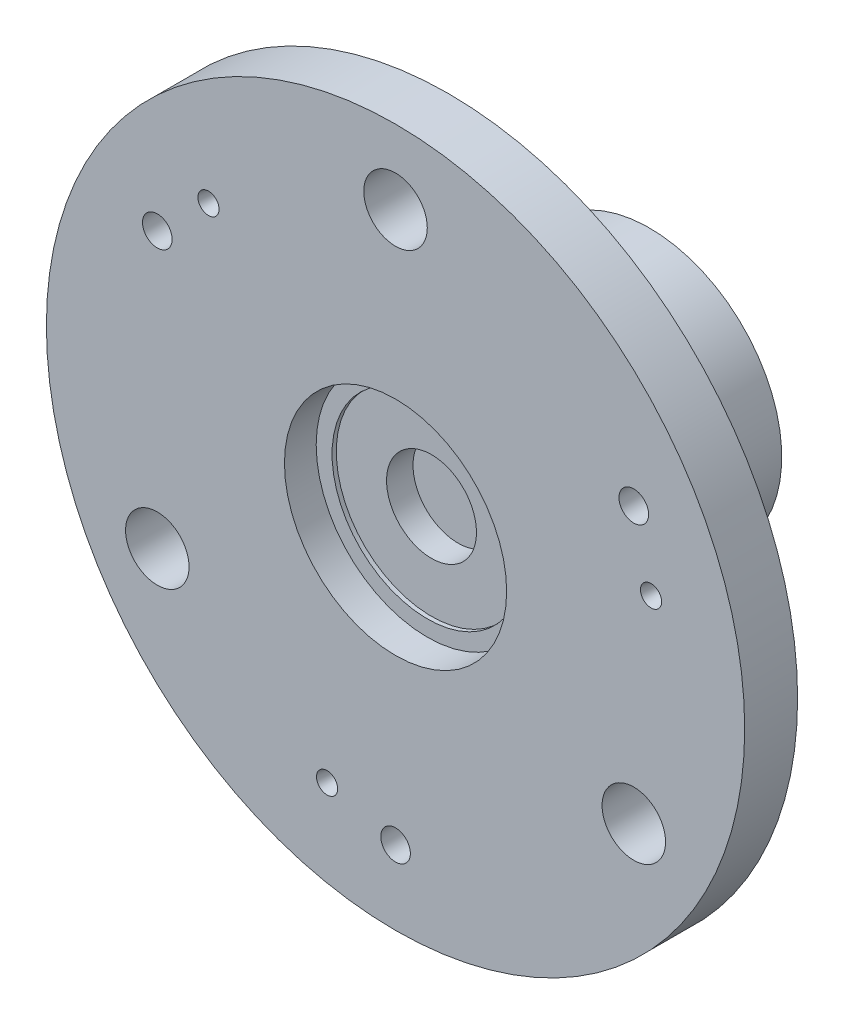
ISO-10303-21;
HEADER;
FILE_DESCRIPTION(('STEP AP214'),'2;1');
FILE_NAME('part.step','',(''),(''),'','','');
FILE_SCHEMA(('AUTOMOTIVE_DESIGN { 1 0 10303 214 1 1 1 1 }'));
ENDSEC;
DATA;
#1=APPLICATION_CONTEXT('core data for automotive mechanical design processes');
#2=APPLICATION_PROTOCOL_DEFINITION('international standard','automotive_design',2000,#1);
#3=PRODUCT_CONTEXT('',#1,'mechanical');
#4=PRODUCT('Part','Part','',(#3));
#5=PRODUCT_RELATED_PRODUCT_CATEGORY('part','',(#4));
#6=PRODUCT_DEFINITION_FORMATION('','',#4);
#7=PRODUCT_DEFINITION_CONTEXT('part definition',#1,'design');
#8=PRODUCT_DEFINITION('design','',#6,#7);
#9=PRODUCT_DEFINITION_SHAPE('','',#8);
#10=(LENGTH_UNIT() NAMED_UNIT(*) SI_UNIT(.MILLI.,.METRE.));
#11=(NAMED_UNIT(*) PLANE_ANGLE_UNIT() SI_UNIT($,.RADIAN.));
#12=(NAMED_UNIT(*) SI_UNIT($,.STERADIAN.) SOLID_ANGLE_UNIT());
#13=UNCERTAINTY_MEASURE_WITH_UNIT(LENGTH_MEASURE(1.E-05),#10,'distance_accuracy_value','');
#14=(GEOMETRIC_REPRESENTATION_CONTEXT(3) GLOBAL_UNCERTAINTY_ASSIGNED_CONTEXT((#13)) GLOBAL_UNIT_ASSIGNED_CONTEXT((#10,
#11,#12)) REPRESENTATION_CONTEXT('',''));
#15=CARTESIAN_POINT('',(0.,0.,0.));
#16=DIRECTION('',(0.,0.,1.));
#17=DIRECTION('',(1.,0.,0.));
#18=AXIS2_PLACEMENT_3D('',#15,#16,#17);
#19=CARTESIAN_POINT('',(0.,0.,-9.));
#20=DIRECTION('',(0.,0.,-1.));
#21=DIRECTION('',(0.,-1.,0.));
#22=AXIS2_PLACEMENT_3D('',#19,#20,#21);
#23=PLANE('',#22);
#24=CARTESIAN_POINT('',(0.,7.,-9.));
#25=DIRECTION('',(0.,0.,-1.));
#26=DIRECTION('',(-1.,0.,0.));
#27=AXIS2_PLACEMENT_3D('',#24,#25,#26);
#28=CIRCLE('',#27,2.1);
#29=CARTESIAN_POINT('',(-2.1,7.,-9.));
#30=VERTEX_POINT('',#29);
#31=EDGE_CURVE('E11',#30,#30,#28,.T.);
#32=ORIENTED_EDGE('',*,*,#31,.T.);
#33=EDGE_LOOP('',(#32));
#34=FACE_BOUND('',#33,.T.);
#35=ADVANCED_FACE('F17',(#34),#23,.T.);
#36=CARTESIAN_POINT('',(0.,7.,-9.));
#37=DIRECTION('',(0.,0.,-1.));
#38=DIRECTION('',(-1.,0.,0.));
#39=AXIS2_PLACEMENT_3D('',#36,#37,#38);
#40=CYLINDRICAL_SURFACE('',#39,2.1);
#41=CARTESIAN_POINT('',(0.,7.,-19.));
#42=DIRECTION('',(0.,0.,-1.));
#43=DIRECTION('',(-1.,0.,0.));
#44=AXIS2_PLACEMENT_3D('',#41,#42,#43);
#45=CIRCLE('',#44,2.1);
#46=CARTESIAN_POINT('',(-2.1,7.,-19.));
#47=VERTEX_POINT('',#46);
#48=EDGE_CURVE('E299',#47,#47,#45,.T.);
#49=ORIENTED_EDGE('',*,*,#48,.T.);
#50=EDGE_LOOP('',(#49));
#51=FACE_BOUND('',#50,.T.);
#52=ORIENTED_EDGE('',*,*,#31,.F.);
#53=EDGE_LOOP('',(#52));
#54=FACE_BOUND('',#53,.T.);
#55=ADVANCED_FACE('F396',(#51,#54),#40,.F.);
#56=CARTESIAN_POINT('',(0.,0.,-9.));
#57=DIRECTION('',(0.,0.,-1.));
#58=DIRECTION('',(0.,-1.,0.));
#59=AXIS2_PLACEMENT_3D('',#56,#57,#58);
#60=PLANE('',#59);
#61=CARTESIAN_POINT('',(7.,0.,-9.));
#62=DIRECTION('',(0.,0.,-1.));
#63=DIRECTION('',(-1.,0.,0.));
#64=AXIS2_PLACEMENT_3D('',#61,#62,#63);
#65=CIRCLE('',#64,2.1);
#66=CARTESIAN_POINT('',(4.9,0.,-9.));
#67=VERTEX_POINT('',#66);
#68=EDGE_CURVE('E28',#67,#67,#65,.T.);
#69=ORIENTED_EDGE('',*,*,#68,.T.);
#70=EDGE_LOOP('',(#69));
#71=FACE_BOUND('',#70,.T.);
#72=ADVANCED_FACE('F401',(#71),#60,.T.);
#73=CARTESIAN_POINT('',(7.,0.,-9.));
#74=DIRECTION('',(0.,0.,-1.));
#75=DIRECTION('',(-1.,0.,0.));
#76=AXIS2_PLACEMENT_3D('',#73,#74,#75);
#77=CYLINDRICAL_SURFACE('',#76,2.1);
#78=CARTESIAN_POINT('',(7.,0.,-19.));
#79=DIRECTION('',(0.,0.,-1.));
#80=DIRECTION('',(-1.,0.,0.));
#81=AXIS2_PLACEMENT_3D('',#78,#79,#80);
#82=CIRCLE('',#81,2.1);
#83=CARTESIAN_POINT('',(4.9,0.,-19.));
#84=VERTEX_POINT('',#83);
#85=EDGE_CURVE('E302',#84,#84,#82,.T.);
#86=ORIENTED_EDGE('',*,*,#85,.T.);
#87=EDGE_LOOP('',(#86));
#88=FACE_BOUND('',#87,.T.);
#89=ORIENTED_EDGE('',*,*,#68,.F.);
#90=EDGE_LOOP('',(#89));
#91=FACE_BOUND('',#90,.T.);
#92=ADVANCED_FACE('F465',(#88,#91),#77,.F.);
#93=CARTESIAN_POINT('',(0.,0.,-9.));
#94=DIRECTION('',(0.,0.,-1.));
#95=DIRECTION('',(0.,-1.,0.));
#96=AXIS2_PLACEMENT_3D('',#93,#94,#95);
#97=PLANE('',#96);
#98=CARTESIAN_POINT('',(0.,-7.,-9.));
#99=DIRECTION('',(0.,0.,-1.));
#100=DIRECTION('',(-1.,0.,0.));
#101=AXIS2_PLACEMENT_3D('',#98,#99,#100);
#102=CIRCLE('',#101,2.1);
#103=CARTESIAN_POINT('',(-2.1,-7.,-9.));
#104=VERTEX_POINT('',#103);
#105=EDGE_CURVE('E222',#104,#104,#102,.T.);
#106=ORIENTED_EDGE('',*,*,#105,.T.);
#107=EDGE_LOOP('',(#106));
#108=FACE_BOUND('',#107,.T.);
#109=ADVANCED_FACE('F408',(#108),#97,.T.);
#110=CARTESIAN_POINT('',(0.,-7.,-9.));
#111=DIRECTION('',(0.,0.,-1.));
#112=DIRECTION('',(-1.,0.,0.));
#113=AXIS2_PLACEMENT_3D('',#110,#111,#112);
#114=CYLINDRICAL_SURFACE('',#113,2.1);
#115=CARTESIAN_POINT('',(0.,-7.,-19.));
#116=DIRECTION('',(0.,0.,-1.));
#117=DIRECTION('',(-1.,0.,0.));
#118=AXIS2_PLACEMENT_3D('',#115,#116,#117);
#119=CIRCLE('',#118,2.1);
#120=CARTESIAN_POINT('',(-2.1,-7.,-19.));
#121=VERTEX_POINT('',#120);
#122=EDGE_CURVE('E307',#121,#121,#119,.T.);
#123=ORIENTED_EDGE('',*,*,#122,.T.);
#124=EDGE_LOOP('',(#123));
#125=FACE_BOUND('',#124,.T.);
#126=ORIENTED_EDGE('',*,*,#105,.F.);
#127=EDGE_LOOP('',(#126));
#128=FACE_BOUND('',#127,.T.);
#129=ADVANCED_FACE('F405',(#125,#128),#114,.F.);
#130=CARTESIAN_POINT('',(0.,0.,-9.));
#131=DIRECTION('',(0.,0.,-1.));
#132=DIRECTION('',(0.,-1.,0.));
#133=AXIS2_PLACEMENT_3D('',#130,#131,#132);
#134=PLANE('',#133);
#135=CARTESIAN_POINT('',(-7.,0.,-9.));
#136=DIRECTION('',(0.,0.,-1.));
#137=DIRECTION('',(-1.,0.,0.));
#138=AXIS2_PLACEMENT_3D('',#135,#136,#137);
#139=CIRCLE('',#138,2.1);
#140=CARTESIAN_POINT('',(-9.1,0.,-9.));
#141=VERTEX_POINT('',#140);
#142=EDGE_CURVE('E220',#141,#141,#139,.T.);
#143=ORIENTED_EDGE('',*,*,#142,.T.);
#144=EDGE_LOOP('',(#143));
#145=FACE_BOUND('',#144,.T.);
#146=ADVANCED_FACE('F407',(#145),#134,.T.);
#147=CARTESIAN_POINT('',(-7.,0.,-9.));
#148=DIRECTION('',(0.,0.,-1.));
#149=DIRECTION('',(-1.,0.,0.));
#150=AXIS2_PLACEMENT_3D('',#147,#148,#149);
#151=CYLINDRICAL_SURFACE('',#150,2.1);
#152=CARTESIAN_POINT('',(-7.,0.,-19.));
#153=DIRECTION('',(0.,0.,-1.));
#154=DIRECTION('',(-1.,0.,0.));
#155=AXIS2_PLACEMENT_3D('',#152,#153,#154);
#156=CIRCLE('',#155,2.1);
#157=CARTESIAN_POINT('',(-9.1,0.,-19.));
#158=VERTEX_POINT('',#157);
#159=EDGE_CURVE('E304',#158,#158,#156,.T.);
#160=ORIENTED_EDGE('',*,*,#159,.T.);
#161=EDGE_LOOP('',(#160));
#162=FACE_BOUND('',#161,.T.);
#163=ORIENTED_EDGE('',*,*,#142,.F.);
#164=EDGE_LOOP('',(#163));
#165=FACE_BOUND('',#164,.T.);
#166=ADVANCED_FACE('F422',(#162,#165),#151,.F.);
#167=CARTESIAN_POINT('',(0.,0.,-0.9));
#168=DIRECTION('',(0.,0.,1.));
#169=DIRECTION('',(1.,0.,0.));
#170=AXIS2_PLACEMENT_3D('',#167,#168,#169);
#171=PLANE('',#170);
#172=CARTESIAN_POINT('',(0.,0.,-0.9));
#173=DIRECTION('',(0.,0.,1.));
#174=DIRECTION('',(1.,0.,0.));
#175=AXIS2_PLACEMENT_3D('',#172,#173,#174);
#176=CIRCLE('',#175,4.25);
#177=CARTESIAN_POINT('',(4.25,0.,-0.9));
#178=VERTEX_POINT('',#177);
#179=EDGE_CURVE('E223',#178,#178,#176,.T.);
#180=ORIENTED_EDGE('',*,*,#179,.T.);
#181=EDGE_LOOP('',(#180));
#182=FACE_BOUND('',#181,.T.);
#183=ADVANCED_FACE('F447',(#182),#171,.T.);
#184=CARTESIAN_POINT('',(0.,0.,-0.9));
#185=DIRECTION('',(0.,0.,1.));
#186=DIRECTION('',(1.,0.,0.));
#187=AXIS2_PLACEMENT_3D('',#184,#185,#186);
#188=CYLINDRICAL_SURFACE('',#187,4.25);
#189=CARTESIAN_POINT('',(0.,0.,1.6));
#190=DIRECTION('',(0.,0.,1.));
#191=DIRECTION('',(1.,0.,0.));
#192=AXIS2_PLACEMENT_3D('',#189,#190,#191);
#193=CIRCLE('',#192,4.25);
#194=CARTESIAN_POINT('',(4.25,0.,1.6));
#195=VERTEX_POINT('',#194);
#196=EDGE_CURVE('E308',#195,#195,#193,.T.);
#197=ORIENTED_EDGE('',*,*,#196,.T.);
#198=EDGE_LOOP('',(#197));
#199=FACE_BOUND('',#198,.T.);
#200=ORIENTED_EDGE('',*,*,#179,.F.);
#201=EDGE_LOOP('',(#200));
#202=FACE_BOUND('',#201,.T.);
#203=ADVANCED_FACE('F437',(#199,#202),#188,.F.);
#204=CARTESIAN_POINT('',(0.,0.,1.6));
#205=DIRECTION('',(0.,0.,1.));
#206=DIRECTION('',(1.,0.,0.));
#207=AXIS2_PLACEMENT_3D('',#204,#205,#206);
#208=PLANE('',#207);
#209=CARTESIAN_POINT('',(0.,0.,1.6));
#210=DIRECTION('',(0.,0.,1.));
#211=DIRECTION('',(1.,0.,0.));
#212=AXIS2_PLACEMENT_3D('',#209,#210,#211);
#213=CIRCLE('',#212,9.);
#214=CARTESIAN_POINT('',(9.,0.,1.6));
#215=VERTEX_POINT('',#214);
#216=EDGE_CURVE('E253',#215,#215,#213,.T.);
#217=ORIENTED_EDGE('',*,*,#216,.T.);
#218=EDGE_LOOP('',(#217));
#219=FACE_BOUND('',#218,.T.);
#220=ORIENTED_EDGE('',*,*,#196,.F.);
#221=EDGE_LOOP('',(#220));
#222=FACE_BOUND('',#221,.T.);
#223=ADVANCED_FACE('F434',(#219,#222),#208,.T.);
#224=CARTESIAN_POINT('',(0.,0.,2.));
#225=DIRECTION('',(0.,0.,1.));
#226=DIRECTION('',(1.,0.,0.));
#227=AXIS2_PLACEMENT_3D('',#224,#225,#226);
#228=PLANE('',#227);
#229=CARTESIAN_POINT('',(0.,0.,2.));
#230=DIRECTION('',(0.,0.,1.));
#231=DIRECTION('',(1.,0.,0.));
#232=AXIS2_PLACEMENT_3D('',#229,#230,#231);
#233=CIRCLE('',#232,10.5);
#234=CARTESIAN_POINT('',(10.5,0.,2.));
#235=VERTEX_POINT('',#234);
#236=EDGE_CURVE('E267',#235,#235,#233,.T.);
#237=ORIENTED_EDGE('',*,*,#236,.T.);
#238=EDGE_LOOP('',(#237));
#239=FACE_BOUND('',#238,.T.);
#240=CARTESIAN_POINT('',(0.,0.,2.));
#241=DIRECTION('',(0.,0.,1.));
#242=DIRECTION('',(1.,0.,0.));
#243=AXIS2_PLACEMENT_3D('',#240,#241,#242);
#244=CIRCLE('',#243,9.);
#245=CARTESIAN_POINT('',(9.,0.,2.));
#246=VERTEX_POINT('',#245);
#247=EDGE_CURVE('E311',#246,#246,#244,.T.);
#248=ORIENTED_EDGE('',*,*,#247,.F.);
#249=EDGE_LOOP('',(#248));
#250=FACE_BOUND('',#249,.T.);
#251=ADVANCED_FACE('F436',(#239,#250),#228,.T.);
#252=CARTESIAN_POINT('',(0.,0.,2.));
#253=DIRECTION('',(0.,0.,-1.));
#254=DIRECTION('',(-1.,0.,0.));
#255=AXIS2_PLACEMENT_3D('',#252,#253,#254);
#256=CYLINDRICAL_SURFACE('',#255,9.);
#257=ORIENTED_EDGE('',*,*,#247,.T.);
#258=EDGE_LOOP('',(#257));
#259=FACE_BOUND('',#258,.T.);
#260=ORIENTED_EDGE('',*,*,#216,.F.);
#261=EDGE_LOOP('',(#260));
#262=FACE_BOUND('',#261,.T.);
#263=ADVANCED_FACE('F440',(#259,#262),#256,.F.);
#264=CARTESIAN_POINT('',(0.,0.,-19.));
#265=DIRECTION('',(0.,0.,-1.));
#266=DIRECTION('',(0.,-1.,0.));
#267=AXIS2_PLACEMENT_3D('',#264,#265,#266);
#268=PLANE('',#267);
#269=CARTESIAN_POINT('',(0.,0.,-19.));
#270=DIRECTION('',(0.,0.,-1.));
#271=DIRECTION('',(-1.,0.,0.));
#272=AXIS2_PLACEMENT_3D('',#269,#270,#271);
#273=CIRCLE('',#272,12.5);
#274=CARTESIAN_POINT('',(-12.5,0.,-19.));
#275=VERTEX_POINT('',#274);
#276=EDGE_CURVE('E303',#275,#275,#273,.T.);
#277=ORIENTED_EDGE('',*,*,#276,.T.);
#278=EDGE_LOOP('',(#277));
#279=FACE_BOUND('',#278,.T.);
#280=ORIENTED_EDGE('',*,*,#159,.F.);
#281=EDGE_LOOP('',(#280));
#282=FACE_BOUND('',#281,.T.);
#283=ORIENTED_EDGE('',*,*,#122,.F.);
#284=EDGE_LOOP('',(#283));
#285=FACE_BOUND('',#284,.T.);
#286=ORIENTED_EDGE('',*,*,#85,.F.);
#287=EDGE_LOOP('',(#286));
#288=FACE_BOUND('',#287,.T.);
#289=ORIENTED_EDGE('',*,*,#48,.F.);
#290=EDGE_LOOP('',(#289));
#291=FACE_BOUND('',#290,.T.);
#292=ADVANCED_FACE('F443',(#279,#282,#285,#288,#291),#268,.T.);
#293=CARTESIAN_POINT('',(0.,0.,-19.));
#294=DIRECTION('',(0.,0.,1.));
#295=DIRECTION('',(1.,0.,0.));
#296=AXIS2_PLACEMENT_3D('',#293,#294,#295);
#297=CYLINDRICAL_SURFACE('',#296,12.5);
#298=CARTESIAN_POINT('',(0.,0.,-4.));
#299=DIRECTION('',(0.,0.,-1.));
#300=DIRECTION('',(-1.,0.,0.));
#301=AXIS2_PLACEMENT_3D('',#298,#299,#300);
#302=CIRCLE('',#301,12.5);
#303=CARTESIAN_POINT('',(-12.5,0.,-4.));
#304=VERTEX_POINT('',#303);
#305=EDGE_CURVE('E265',#304,#304,#302,.T.);
#306=ORIENTED_EDGE('',*,*,#305,.T.);
#307=EDGE_LOOP('',(#306));
#308=FACE_BOUND('',#307,.T.);
#309=ORIENTED_EDGE('',*,*,#276,.F.);
#310=EDGE_LOOP('',(#309));
#311=FACE_BOUND('',#310,.T.);
#312=ADVANCED_FACE('F472',(#308,#311),#297,.T.);
#313=CARTESIAN_POINT('',(0.,0.,-2.));
#314=DIRECTION('',(0.,0.,1.));
#315=DIRECTION('',(1.,0.,0.));
#316=AXIS2_PLACEMENT_3D('',#313,#314,#315);
#317=CONICAL_SURFACE('',#316,14.5,0.785398163397448);
#318=CARTESIAN_POINT('',(0.,0.,-2.));
#319=DIRECTION('',(0.,0.,-1.));
#320=DIRECTION('',(1.,0.,0.));
#321=AXIS2_PLACEMENT_3D('',#318,#319,#320);
#322=CIRCLE('',#321,14.5);
#323=CARTESIAN_POINT('',(14.5,0.,-2.));
#324=VERTEX_POINT('',#323);
#325=EDGE_CURVE('E226',#324,#324,#322,.T.);
#326=ORIENTED_EDGE('',*,*,#325,.F.);
#327=EDGE_LOOP('',(#326));
#328=FACE_BOUND('',#327,.T.);
#329=CARTESIAN_POINT('',(0.,0.,0.));
#330=DIRECTION('',(0.,0.,1.));
#331=DIRECTION('',(1.,0.,0.));
#332=AXIS2_PLACEMENT_3D('',#329,#330,#331);
#333=CIRCLE('',#332,16.5);
#334=CARTESIAN_POINT('',(16.5,0.,0.));
#335=VERTEX_POINT('',#334);
#336=EDGE_CURVE('E218',#335,#335,#333,.T.);
#337=ORIENTED_EDGE('',*,*,#336,.F.);
#338=EDGE_LOOP('',(#337));
#339=FACE_BOUND('',#338,.T.);
#340=ADVANCED_FACE('F475',(#328,#339),#317,.T.);
#341=CARTESIAN_POINT('',(0.,0.,-0.4));
#342=DIRECTION('',(0.,0.,1.));
#343=DIRECTION('',(1.,0.,0.));
#344=AXIS2_PLACEMENT_3D('',#341,#342,#343);
#345=CYLINDRICAL_SURFACE('',#344,10.5);
#346=CARTESIAN_POINT('',(0.,0.,5.));
#347=DIRECTION('',(0.,0.,1.));
#348=DIRECTION('',(1.,0.,0.));
#349=AXIS2_PLACEMENT_3D('',#346,#347,#348);
#350=CIRCLE('',#349,10.5);
#351=CARTESIAN_POINT('',(10.5,0.,5.));
#352=VERTEX_POINT('',#351);
#353=EDGE_CURVE('E209',#352,#352,#350,.T.);
#354=ORIENTED_EDGE('',*,*,#353,.T.);
#355=EDGE_LOOP('',(#354));
#356=FACE_BOUND('',#355,.T.);
#357=ORIENTED_EDGE('',*,*,#236,.F.);
#358=EDGE_LOOP('',(#357));
#359=FACE_BOUND('',#358,.T.);
#360=ADVANCED_FACE('F486',(#356,#359),#345,.F.);
#361=CARTESIAN_POINT('',(0.,0.,-4.));
#362=DIRECTION('',(0.,0.,-1.));
#363=DIRECTION('',(0.,-1.,0.));
#364=AXIS2_PLACEMENT_3D('',#361,#362,#363);
#365=PLANE('',#364);
#366=CARTESIAN_POINT('',(0.,0.,-4.));
#367=DIRECTION('',(0.,0.,-1.));
#368=DIRECTION('',(-1.,0.,0.));
#369=AXIS2_PLACEMENT_3D('',#366,#367,#368);
#370=CIRCLE('',#369,14.5);
#371=CARTESIAN_POINT('',(-14.5,0.,-4.));
#372=VERTEX_POINT('',#371);
#373=EDGE_CURVE('E233',#372,#372,#370,.T.);
#374=ORIENTED_EDGE('',*,*,#373,.T.);
#375=EDGE_LOOP('',(#374));
#376=FACE_BOUND('',#375,.T.);
#377=ORIENTED_EDGE('',*,*,#305,.F.);
#378=EDGE_LOOP('',(#377));
#379=FACE_BOUND('',#378,.T.);
#380=ADVANCED_FACE('F461',(#376,#379),#365,.T.);
#381=CARTESIAN_POINT('',(0.,0.,-4.));
#382=DIRECTION('',(0.,0.,1.));
#383=DIRECTION('',(1.,0.,0.));
#384=AXIS2_PLACEMENT_3D('',#381,#382,#383);
#385=CYLINDRICAL_SURFACE('',#384,14.5);
#386=ORIENTED_EDGE('',*,*,#373,.F.);
#387=EDGE_LOOP('',(#386));
#388=FACE_BOUND('',#387,.T.);
#389=ORIENTED_EDGE('',*,*,#325,.T.);
#390=EDGE_LOOP('',(#389));
#391=FACE_BOUND('',#390,.T.);
#392=ADVANCED_FACE('F428',(#388,#391),#385,.T.);
#393=CARTESIAN_POINT('',(3.23523806378151,-7.16116523516816,2.8));
#394=DIRECTION('',(0.,0.,-1.));
#395=DIRECTION('',(0.,-1.,0.));
#396=AXIS2_PLACEMENT_3D('',#393,#394,#395);
#397=PLANE('',#396);
#398=CARTESIAN_POINT('',(-6.47047612756302,-24.1481456572267,2.8));
#399=DIRECTION('',(0.,0.,-1.));
#400=DIRECTION('',(-1.,0.,0.));
#401=AXIS2_PLACEMENT_3D('',#398,#399,#400);
#402=CIRCLE('',#401,0.532375564325951);
#403=CARTESIAN_POINT('',(-7.00285169188897,-24.1481456572267,2.8));
#404=VERTEX_POINT('',#403);
#405=EDGE_CURVE('E224',#404,#404,#402,.T.);
#406=ORIENTED_EDGE('',*,*,#405,.F.);
#407=EDGE_LOOP('',(#406));
#408=FACE_BOUND('',#407,.T.);
#409=ADVANCED_FACE('F424',(#408),#397,.F.);
#410=CARTESIAN_POINT('',(-6.47047612756302,-24.1481456572267,5.));
#411=DIRECTION('',(0.,0.,1.));
#412=DIRECTION('',(-1.,0.,0.));
#413=AXIS2_PLACEMENT_3D('',#410,#411,#412);
#414=CONICAL_SURFACE('',#413,1.,0.20943951023932);
#415=CARTESIAN_POINT('',(-6.47047612756302,-24.1481456572267,5.));
#416=DIRECTION('',(0.,0.,-1.));
#417=DIRECTION('',(-1.,0.,0.));
#418=AXIS2_PLACEMENT_3D('',#415,#416,#417);
#419=CIRCLE('',#418,1.);
#420=CARTESIAN_POINT('',(-7.47047612756302,-24.1481456572267,5.));
#421=VERTEX_POINT('',#420);
#422=EDGE_CURVE('E200',#421,#421,#419,.T.);
#423=ORIENTED_EDGE('',*,*,#422,.F.);
#424=EDGE_LOOP('',(#423));
#425=FACE_BOUND('',#424,.T.);
#426=ORIENTED_EDGE('',*,*,#405,.T.);
#427=EDGE_LOOP('',(#426));
#428=FACE_BOUND('',#427,.T.);
#429=ADVANCED_FACE('F427',(#425,#428),#414,.F.);
#430=CARTESIAN_POINT('',(3.23523806378151,-7.16116523516816,2.8));
#431=DIRECTION('',(0.,0.,-1.));
#432=DIRECTION('',(0.,-1.,0.));
#433=AXIS2_PLACEMENT_3D('',#430,#431,#432);
#434=PLANE('',#433);
#435=CARTESIAN_POINT('',(-17.6776695296637,17.6776695296637,2.8));
#436=DIRECTION('',(0.,0.,-1.));
#437=DIRECTION('',(-1.,0.,0.));
#438=AXIS2_PLACEMENT_3D('',#435,#436,#437);
#439=CIRCLE('',#438,0.532375564325952);
#440=CARTESIAN_POINT('',(-18.2100450939897,17.6776695296637,2.8));
#441=VERTEX_POINT('',#440);
#442=EDGE_CURVE('E21',#441,#441,#439,.T.);
#443=ORIENTED_EDGE('',*,*,#442,.F.);
#444=EDGE_LOOP('',(#443));
#445=FACE_BOUND('',#444,.T.);
#446=ADVANCED_FACE('F454',(#445),#434,.F.);
#447=CARTESIAN_POINT('',(-17.6776695296637,17.6776695296637,5.));
#448=DIRECTION('',(0.,0.,1.));
#449=DIRECTION('',(-1.,0.,0.));
#450=AXIS2_PLACEMENT_3D('',#447,#448,#449);
#451=CONICAL_SURFACE('',#450,1.,0.20943951023932);
#452=CARTESIAN_POINT('',(-17.6776695296637,17.6776695296637,5.));
#453=DIRECTION('',(0.,0.,-1.));
#454=DIRECTION('',(-1.,0.,0.));
#455=AXIS2_PLACEMENT_3D('',#452,#453,#454);
#456=CIRCLE('',#455,1.);
#457=CARTESIAN_POINT('',(-18.6776695296637,17.6776695296637,5.));
#458=VERTEX_POINT('',#457);
#459=EDGE_CURVE('E194',#458,#458,#456,.T.);
#460=ORIENTED_EDGE('',*,*,#459,.F.);
#461=EDGE_LOOP('',(#460));
#462=FACE_BOUND('',#461,.T.);
#463=ORIENTED_EDGE('',*,*,#442,.T.);
#464=EDGE_LOOP('',(#463));
#465=FACE_BOUND('',#464,.T.);
#466=ADVANCED_FACE('F390',(#462,#465),#451,.F.);
#467=CARTESIAN_POINT('',(3.23523806378151,-7.16116523516816,2.8));
#468=DIRECTION('',(0.,0.,-1.));
#469=DIRECTION('',(0.,-1.,0.));
#470=AXIS2_PLACEMENT_3D('',#467,#468,#469);
#471=PLANE('',#470);
#472=CARTESIAN_POINT('',(24.1481456572267,6.47047612756302,2.8));
#473=DIRECTION('',(0.,0.,-1.));
#474=DIRECTION('',(-1.,0.,0.));
#475=AXIS2_PLACEMENT_3D('',#472,#473,#474);
#476=CIRCLE('',#475,0.532375564325951);
#477=CARTESIAN_POINT('',(23.6157700929007,6.47047612756302,2.8));
#478=VERTEX_POINT('',#477);
#479=EDGE_CURVE('E235',#478,#478,#476,.T.);
#480=ORIENTED_EDGE('',*,*,#479,.F.);
#481=EDGE_LOOP('',(#480));
#482=FACE_BOUND('',#481,.T.);
#483=ADVANCED_FACE('F381',(#482),#471,.F.);
#484=CARTESIAN_POINT('',(24.1481456572267,6.47047612756302,5.));
#485=DIRECTION('',(0.,0.,1.));
#486=DIRECTION('',(-1.,0.,0.));
#487=AXIS2_PLACEMENT_3D('',#484,#485,#486);
#488=CONICAL_SURFACE('',#487,1.,0.20943951023932);
#489=CARTESIAN_POINT('',(24.1481456572267,6.47047612756302,5.));
#490=DIRECTION('',(0.,0.,-1.));
#491=DIRECTION('',(-1.,0.,0.));
#492=AXIS2_PLACEMENT_3D('',#489,#490,#491);
#493=CIRCLE('',#492,1.);
#494=CARTESIAN_POINT('',(23.1481456572267,6.47047612756302,5.));
#495=VERTEX_POINT('',#494);
#496=EDGE_CURVE('E199',#495,#495,#493,.T.);
#497=ORIENTED_EDGE('',*,*,#496,.F.);
#498=EDGE_LOOP('',(#497));
#499=FACE_BOUND('',#498,.T.);
#500=ORIENTED_EDGE('',*,*,#479,.T.);
#501=EDGE_LOOP('',(#500));
#502=FACE_BOUND('',#501,.T.);
#503=ADVANCED_FACE('F379',(#499,#502),#488,.F.);
#504=CARTESIAN_POINT('',(22.5166604983954,13.,0.));
#505=DIRECTION('',(0.,0.,-1.));
#506=DIRECTION('',(-1.,0.,0.));
#507=AXIS2_PLACEMENT_3D('',#504,#505,#506);
#508=CONICAL_SURFACE('',#507,3.75,0.785398163397448);
#509=CARTESIAN_POINT('',(22.5166604983954,13.,0.));
#510=DIRECTION('',(0.,0.,1.));
#511=DIRECTION('',(1.,0.,0.));
#512=AXIS2_PLACEMENT_3D('',#509,#510,#511);
#513=CIRCLE('',#512,3.75);
#514=CARTESIAN_POINT('',(26.2666604983954,13.,0.));
#515=VERTEX_POINT('',#514);
#516=EDGE_CURVE('E213',#515,#515,#513,.T.);
#517=ORIENTED_EDGE('',*,*,#516,.F.);
#518=EDGE_LOOP('',(#517));
#519=FACE_BOUND('',#518,.T.);
#520=CARTESIAN_POINT('',(22.5166604983954,13.,2.35));
#521=DIRECTION('',(0.,0.,1.));
#522=DIRECTION('',(1.,0.,0.));
#523=AXIS2_PLACEMENT_3D('',#520,#521,#522);
#524=CIRCLE('',#523,1.4);
#525=CARTESIAN_POINT('',(23.9166604983954,13.,2.35));
#526=VERTEX_POINT('',#525);
#527=EDGE_CURVE('E242',#526,#526,#524,.T.);
#528=ORIENTED_EDGE('',*,*,#527,.T.);
#529=EDGE_LOOP('',(#528));
#530=FACE_BOUND('',#529,.T.);
#531=ADVANCED_FACE('F19',(#519,#530),#508,.F.);
#532=CARTESIAN_POINT('',(22.5166604983954,13.,0.));
#533=DIRECTION('',(0.,0.,1.));
#534=DIRECTION('',(1.,0.,0.));
#535=AXIS2_PLACEMENT_3D('',#532,#533,#534);
#536=CYLINDRICAL_SURFACE('',#535,1.4);
#537=ORIENTED_EDGE('',*,*,#527,.F.);
#538=EDGE_LOOP('',(#537));
#539=FACE_BOUND('',#538,.T.);
#540=CARTESIAN_POINT('',(22.5166604983954,13.,5.));
#541=DIRECTION('',(0.,0.,-1.));
#542=DIRECTION('',(1.,0.,0.));
#543=AXIS2_PLACEMENT_3D('',#540,#541,#542);
#544=CIRCLE('',#543,1.4);
#545=CARTESIAN_POINT('',(23.9166604983954,13.,5.));
#546=VERTEX_POINT('',#545);
#547=EDGE_CURVE('E207',#546,#546,#544,.T.);
#548=ORIENTED_EDGE('',*,*,#547,.F.);
#549=EDGE_LOOP('',(#548));
#550=FACE_BOUND('',#549,.T.);
#551=ADVANCED_FACE('F359',(#539,#550),#536,.F.);
#552=CARTESIAN_POINT('',(-22.5166604983954,13.,0.));
#553=DIRECTION('',(0.,0.,-1.));
#554=DIRECTION('',(-1.,0.,0.));
#555=AXIS2_PLACEMENT_3D('',#552,#553,#554);
#556=CONICAL_SURFACE('',#555,3.75,0.785398163397448);
#557=CARTESIAN_POINT('',(-22.5166604983954,13.,0.));
#558=DIRECTION('',(0.,0.,1.));
#559=DIRECTION('',(1.,0.,0.));
#560=AXIS2_PLACEMENT_3D('',#557,#558,#559);
#561=CIRCLE('',#560,3.75);
#562=CARTESIAN_POINT('',(-18.7666604983954,13.,0.));
#563=VERTEX_POINT('',#562);
#564=EDGE_CURVE('E282',#563,#563,#561,.T.);
#565=ORIENTED_EDGE('',*,*,#564,.F.);
#566=EDGE_LOOP('',(#565));
#567=FACE_BOUND('',#566,.T.);
#568=CARTESIAN_POINT('',(-22.5166604983954,13.,2.35));
#569=DIRECTION('',(0.,0.,1.));
#570=DIRECTION('',(1.,0.,0.));
#571=AXIS2_PLACEMENT_3D('',#568,#569,#570);
#572=CIRCLE('',#571,1.4);
#573=CARTESIAN_POINT('',(-21.1166604983954,13.,2.35));
#574=VERTEX_POINT('',#573);
#575=EDGE_CURVE('E249',#574,#574,#572,.T.);
#576=ORIENTED_EDGE('',*,*,#575,.T.);
#577=EDGE_LOOP('',(#576));
#578=FACE_BOUND('',#577,.T.);
#579=ADVANCED_FACE('F355',(#567,#578),#556,.F.);
#580=CARTESIAN_POINT('',(-22.5166604983954,13.,0.));
#581=DIRECTION('',(0.,0.,1.));
#582=DIRECTION('',(1.,0.,0.));
#583=AXIS2_PLACEMENT_3D('',#580,#581,#582);
#584=CYLINDRICAL_SURFACE('',#583,1.4);
#585=ORIENTED_EDGE('',*,*,#575,.F.);
#586=EDGE_LOOP('',(#585));
#587=FACE_BOUND('',#586,.T.);
#588=CARTESIAN_POINT('',(-22.5166604983954,13.,5.));
#589=DIRECTION('',(0.,0.,-1.));
#590=DIRECTION('',(1.,0.,0.));
#591=AXIS2_PLACEMENT_3D('',#588,#589,#590);
#592=CIRCLE('',#591,1.4);
#593=CARTESIAN_POINT('',(-21.1166604983954,13.,5.));
#594=VERTEX_POINT('',#593);
#595=EDGE_CURVE('E219',#594,#594,#592,.T.);
#596=ORIENTED_EDGE('',*,*,#595,.F.);
#597=EDGE_LOOP('',(#596));
#598=FACE_BOUND('',#597,.T.);
#599=ADVANCED_FACE('F358',(#587,#598),#584,.F.);
#600=CARTESIAN_POINT('',(0.,-26.,0.));
#601=DIRECTION('',(0.,0.,-1.));
#602=DIRECTION('',(-1.,0.,0.));
#603=AXIS2_PLACEMENT_3D('',#600,#601,#602);
#604=CONICAL_SURFACE('',#603,3.75,0.785398163397448);
#605=CARTESIAN_POINT('',(0.,-26.,0.));
#606=DIRECTION('',(0.,0.,1.));
#607=DIRECTION('',(1.,0.,0.));
#608=AXIS2_PLACEMENT_3D('',#605,#606,#607);
#609=CIRCLE('',#608,3.75);
#610=CARTESIAN_POINT('',(3.75,-26.,0.));
#611=VERTEX_POINT('',#610);
#612=EDGE_CURVE('E283',#611,#611,#609,.T.);
#613=ORIENTED_EDGE('',*,*,#612,.F.);
#614=EDGE_LOOP('',(#613));
#615=FACE_BOUND('',#614,.T.);
#616=CARTESIAN_POINT('',(0.,-26.,2.35));
#617=DIRECTION('',(0.,0.,1.));
#618=DIRECTION('',(1.,0.,0.));
#619=AXIS2_PLACEMENT_3D('',#616,#617,#618);
#620=CIRCLE('',#619,1.4);
#621=CARTESIAN_POINT('',(1.4,-26.,2.35));
#622=VERTEX_POINT('',#621);
#623=EDGE_CURVE('E286',#622,#622,#620,.T.);
#624=ORIENTED_EDGE('',*,*,#623,.T.);
#625=EDGE_LOOP('',(#624));
#626=FACE_BOUND('',#625,.T.);
#627=ADVANCED_FACE('F366',(#615,#626),#604,.F.);
#628=CARTESIAN_POINT('',(0.,-26.,0.));
#629=DIRECTION('',(0.,0.,1.));
#630=DIRECTION('',(1.,0.,0.));
#631=AXIS2_PLACEMENT_3D('',#628,#629,#630);
#632=CYLINDRICAL_SURFACE('',#631,1.4);
#633=ORIENTED_EDGE('',*,*,#623,.F.);
#634=EDGE_LOOP('',(#633));
#635=FACE_BOUND('',#634,.T.);
#636=CARTESIAN_POINT('',(0.,-26.,5.));
#637=DIRECTION('',(0.,0.,-1.));
#638=DIRECTION('',(1.,0.,0.));
#639=AXIS2_PLACEMENT_3D('',#636,#637,#638);
#640=CIRCLE('',#639,1.4);
#641=CARTESIAN_POINT('',(1.4,-26.,5.));
#642=VERTEX_POINT('',#641);
#643=EDGE_CURVE('E215',#642,#642,#640,.T.);
#644=ORIENTED_EDGE('',*,*,#643,.F.);
#645=EDGE_LOOP('',(#644));
#646=FACE_BOUND('',#645,.T.);
#647=ADVANCED_FACE('F430',(#635,#646),#632,.F.);
#648=CARTESIAN_POINT('',(0.,0.,0.));
#649=DIRECTION('',(0.,0.,1.));
#650=DIRECTION('',(1.,0.,0.));
#651=AXIS2_PLACEMENT_3D('',#648,#649,#650);
#652=PLANE('',#651);
#653=CARTESIAN_POINT('',(0.,0.,0.));
#654=DIRECTION('',(0.,0.,1.));
#655=DIRECTION('',(1.,0.,0.));
#656=AXIS2_PLACEMENT_3D('',#653,#654,#655);
#657=CIRCLE('',#656,33.);
#658=CARTESIAN_POINT('',(33.,0.,0.));
#659=VERTEX_POINT('',#658);
#660=EDGE_CURVE('E262',#659,#659,#657,.T.);
#661=ORIENTED_EDGE('',*,*,#660,.F.);
#662=EDGE_LOOP('',(#661));
#663=FACE_BOUND('',#662,.T.);
#664=CARTESIAN_POINT('',(-22.5166604983954,-13.,0.));
#665=DIRECTION('',(0.,0.,1.));
#666=DIRECTION('',(1.,0.,0.));
#667=AXIS2_PLACEMENT_3D('',#664,#665,#666);
#668=CIRCLE('',#667,3.);
#669=CARTESIAN_POINT('',(-19.5166604983954,-13.,0.));
#670=VERTEX_POINT('',#669);
#671=EDGE_CURVE('E259',#670,#670,#668,.T.);
#672=ORIENTED_EDGE('',*,*,#671,.T.);
#673=EDGE_LOOP('',(#672));
#674=FACE_BOUND('',#673,.T.);
#675=CARTESIAN_POINT('',(22.5166604983954,-13.,0.));
#676=DIRECTION('',(0.,0.,1.));
#677=DIRECTION('',(1.,0.,0.));
#678=AXIS2_PLACEMENT_3D('',#675,#676,#677);
#679=CIRCLE('',#678,3.);
#680=CARTESIAN_POINT('',(25.5166604983954,-13.,0.));
#681=VERTEX_POINT('',#680);
#682=EDGE_CURVE('E258',#681,#681,#679,.T.);
#683=ORIENTED_EDGE('',*,*,#682,.T.);
#684=EDGE_LOOP('',(#683));
#685=FACE_BOUND('',#684,.T.);
#686=CARTESIAN_POINT('',(0.,26.,0.));
#687=DIRECTION('',(0.,0.,1.));
#688=DIRECTION('',(1.,0.,0.));
#689=AXIS2_PLACEMENT_3D('',#686,#687,#688);
#690=CIRCLE('',#689,3.);
#691=CARTESIAN_POINT('',(3.,26.,0.));
#692=VERTEX_POINT('',#691);
#693=EDGE_CURVE('E289',#692,#692,#690,.T.);
#694=ORIENTED_EDGE('',*,*,#693,.T.);
#695=EDGE_LOOP('',(#694));
#696=FACE_BOUND('',#695,.T.);
#697=ORIENTED_EDGE('',*,*,#612,.T.);
#698=EDGE_LOOP('',(#697));
#699=FACE_BOUND('',#698,.T.);
#700=ORIENTED_EDGE('',*,*,#564,.T.);
#701=EDGE_LOOP('',(#700));
#702=FACE_BOUND('',#701,.T.);
#703=ORIENTED_EDGE('',*,*,#516,.T.);
#704=EDGE_LOOP('',(#703));
#705=FACE_BOUND('',#704,.T.);
#706=ORIENTED_EDGE('',*,*,#336,.T.);
#707=EDGE_LOOP('',(#706));
#708=FACE_BOUND('',#707,.T.);
#709=ADVANCED_FACE('F353',(#663,#674,#685,#696,#699,#702,#705,#708),#652,.F.);
#710=CARTESIAN_POINT('',(0.,0.,5.));
#711=DIRECTION('',(0.,0.,1.));
#712=DIRECTION('',(1.,0.,0.));
#713=AXIS2_PLACEMENT_3D('',#710,#711,#712);
#714=PLANE('',#713);
#715=CARTESIAN_POINT('',(0.,0.,5.));
#716=DIRECTION('',(0.,0.,1.));
#717=DIRECTION('',(1.,0.,0.));
#718=AXIS2_PLACEMENT_3D('',#715,#716,#717);
#719=CIRCLE('',#718,33.);
#720=CARTESIAN_POINT('',(33.,0.,5.));
#721=VERTEX_POINT('',#720);
#722=EDGE_CURVE('E292',#721,#721,#719,.T.);
#723=ORIENTED_EDGE('',*,*,#722,.T.);
#724=EDGE_LOOP('',(#723));
#725=FACE_BOUND('',#724,.T.);
#726=CARTESIAN_POINT('',(-22.5166604983954,-13.,5.));
#727=DIRECTION('',(0.,0.,1.));
#728=DIRECTION('',(1.,0.,0.));
#729=AXIS2_PLACEMENT_3D('',#726,#727,#728);
#730=CIRCLE('',#729,3.);
#731=CARTESIAN_POINT('',(-19.5166604983954,-13.,5.));
#732=VERTEX_POINT('',#731);
#733=EDGE_CURVE('E268',#732,#732,#730,.T.);
#734=ORIENTED_EDGE('',*,*,#733,.F.);
#735=EDGE_LOOP('',(#734));
#736=FACE_BOUND('',#735,.T.);
#737=CARTESIAN_POINT('',(22.5166604983954,-13.,5.));
#738=DIRECTION('',(0.,0.,1.));
#739=DIRECTION('',(1.,0.,0.));
#740=AXIS2_PLACEMENT_3D('',#737,#738,#739);
#741=CIRCLE('',#740,3.);
#742=CARTESIAN_POINT('',(25.5166604983954,-13.,5.));
#743=VERTEX_POINT('',#742);
#744=EDGE_CURVE('E255',#743,#743,#741,.T.);
#745=ORIENTED_EDGE('',*,*,#744,.F.);
#746=EDGE_LOOP('',(#745));
#747=FACE_BOUND('',#746,.T.);
#748=CARTESIAN_POINT('',(0.,26.,5.));
#749=DIRECTION('',(0.,0.,1.));
#750=DIRECTION('',(1.,0.,0.));
#751=AXIS2_PLACEMENT_3D('',#748,#749,#750);
#752=CIRCLE('',#751,3.);
#753=CARTESIAN_POINT('',(3.,26.,5.));
#754=VERTEX_POINT('',#753);
#755=EDGE_CURVE('E293',#754,#754,#752,.T.);
#756=ORIENTED_EDGE('',*,*,#755,.F.);
#757=EDGE_LOOP('',(#756));
#758=FACE_BOUND('',#757,.T.);
#759=ORIENTED_EDGE('',*,*,#643,.T.);
#760=EDGE_LOOP('',(#759));
#761=FACE_BOUND('',#760,.T.);
#762=ORIENTED_EDGE('',*,*,#595,.T.);
#763=EDGE_LOOP('',(#762));
#764=FACE_BOUND('',#763,.T.);
#765=ORIENTED_EDGE('',*,*,#547,.T.);
#766=EDGE_LOOP('',(#765));
#767=FACE_BOUND('',#766,.T.);
#768=ORIENTED_EDGE('',*,*,#496,.T.);
#769=EDGE_LOOP('',(#768));
#770=FACE_BOUND('',#769,.T.);
#771=ORIENTED_EDGE('',*,*,#459,.T.);
#772=EDGE_LOOP('',(#771));
#773=FACE_BOUND('',#772,.T.);
#774=ORIENTED_EDGE('',*,*,#422,.T.);
#775=EDGE_LOOP('',(#774));
#776=FACE_BOUND('',#775,.T.);
#777=ORIENTED_EDGE('',*,*,#353,.F.);
#778=EDGE_LOOP('',(#777));
#779=FACE_BOUND('',#778,.T.);
#780=ADVANCED_FACE('F195',(#725,#736,#747,#758,#761,#764,#767,#770,#773,#776,#779),#714,.T.);
#781=CARTESIAN_POINT('',(0.,0.,5.));
#782=DIRECTION('',(0.,0.,-1.));
#783=DIRECTION('',(-1.,0.,0.));
#784=AXIS2_PLACEMENT_3D('',#781,#782,#783);
#785=CYLINDRICAL_SURFACE('',#784,33.);
#786=ORIENTED_EDGE('',*,*,#660,.T.);
#787=EDGE_LOOP('',(#786));
#788=FACE_BOUND('',#787,.T.);
#789=ORIENTED_EDGE('',*,*,#722,.F.);
#790=EDGE_LOOP('',(#789));
#791=FACE_BOUND('',#790,.T.);
#792=ADVANCED_FACE('F372',(#788,#791),#785,.T.);
#793=CARTESIAN_POINT('',(0.,26.,5.));
#794=DIRECTION('',(0.,0.,-1.));
#795=DIRECTION('',(-1.,0.,0.));
#796=AXIS2_PLACEMENT_3D('',#793,#794,#795);
#797=CYLINDRICAL_SURFACE('',#796,3.);
#798=ORIENTED_EDGE('',*,*,#693,.F.);
#799=EDGE_LOOP('',(#798));
#800=FACE_BOUND('',#799,.T.);
#801=ORIENTED_EDGE('',*,*,#755,.T.);
#802=EDGE_LOOP('',(#801));
#803=FACE_BOUND('',#802,.T.);
#804=ADVANCED_FACE('F413',(#800,#803),#797,.F.);
#805=CARTESIAN_POINT('',(22.5166604983954,-13.,5.));
#806=DIRECTION('',(0.,0.,-1.));
#807=DIRECTION('',(-1.,0.,0.));
#808=AXIS2_PLACEMENT_3D('',#805,#806,#807);
#809=CYLINDRICAL_SURFACE('',#808,3.);
#810=ORIENTED_EDGE('',*,*,#682,.F.);
#811=EDGE_LOOP('',(#810));
#812=FACE_BOUND('',#811,.T.);
#813=ORIENTED_EDGE('',*,*,#744,.T.);
#814=EDGE_LOOP('',(#813));
#815=FACE_BOUND('',#814,.T.);
#816=ADVANCED_FACE('F415',(#812,#815),#809,.F.);
#817=CARTESIAN_POINT('',(-22.5166604983954,-13.,5.));
#818=DIRECTION('',(0.,0.,-1.));
#819=DIRECTION('',(-1.,0.,0.));
#820=AXIS2_PLACEMENT_3D('',#817,#818,#819);
#821=CYLINDRICAL_SURFACE('',#820,3.);
#822=ORIENTED_EDGE('',*,*,#671,.F.);
#823=EDGE_LOOP('',(#822));
#824=FACE_BOUND('',#823,.T.);
#825=ORIENTED_EDGE('',*,*,#733,.T.);
#826=EDGE_LOOP('',(#825));
#827=FACE_BOUND('',#826,.T.);
#828=ADVANCED_FACE('F418',(#824,#827),#821,.F.);
#829=CLOSED_SHELL('',(#35,#55,#72,#92,#109,#129,#146,#166,#183,#203,#223,#251,#263,#292,#312,
#340,#360,#380,#392,#409,#429,#446,#466,#483,#503,#531,#551,#579,#599,#627,#647,#709,#780,#792,
#804,#816,#828));
#830=MANIFOLD_SOLID_BREP('B1',#829);
#831=ADVANCED_BREP_SHAPE_REPRESENTATION('',(#18,#830),#14);
#832=SHAPE_DEFINITION_REPRESENTATION(#9,#831);
ENDSEC;
END-ISO-10303-21;
